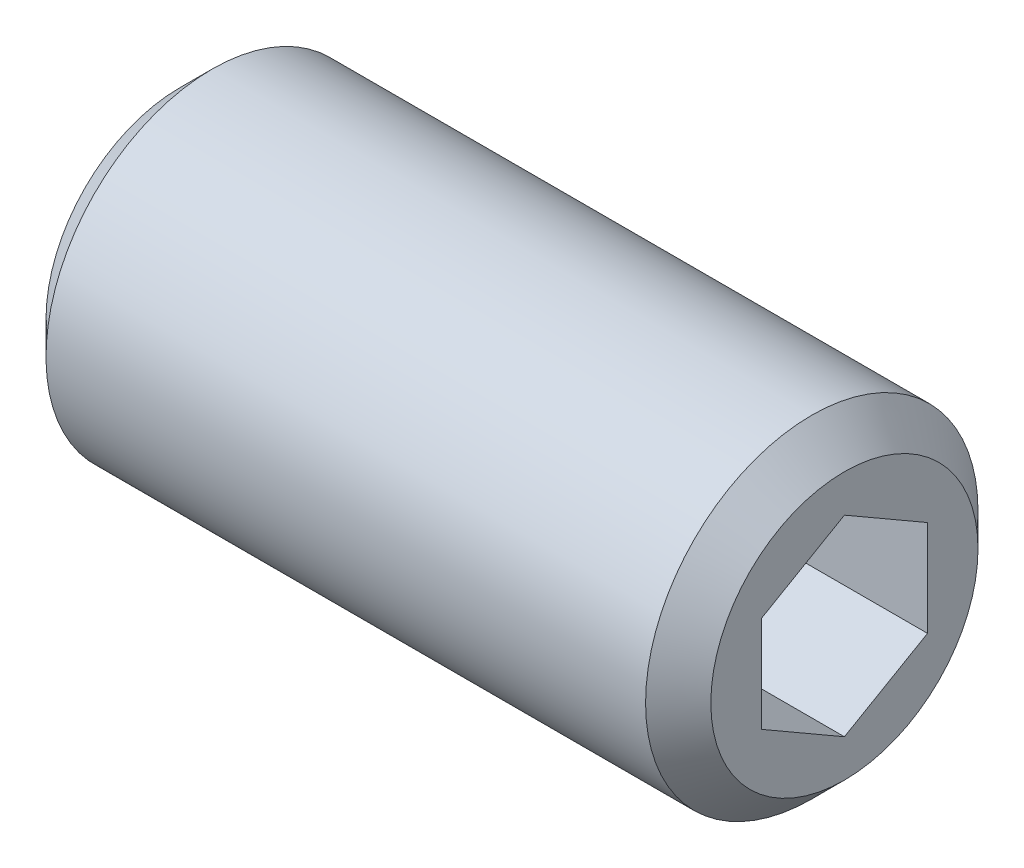
ISO-10303-21;
HEADER;
FILE_DESCRIPTION(('STEP AP214'),'2;1');
FILE_NAME('part.step','',(''),(''),'','','');
FILE_SCHEMA(('AUTOMOTIVE_DESIGN { 1 0 10303 214 1 1 1 1 }'));
ENDSEC;
DATA;
#1=APPLICATION_CONTEXT('core data for automotive mechanical design processes');
#2=APPLICATION_PROTOCOL_DEFINITION('international standard','automotive_design',2000,#1);
#3=PRODUCT_CONTEXT('',#1,'mechanical');
#4=PRODUCT('Part','Part','',(#3));
#5=PRODUCT_RELATED_PRODUCT_CATEGORY('part','',(#4));
#6=PRODUCT_DEFINITION_FORMATION('','',#4);
#7=PRODUCT_DEFINITION_CONTEXT('part definition',#1,'design');
#8=PRODUCT_DEFINITION('design','',#6,#7);
#9=PRODUCT_DEFINITION_SHAPE('','',#8);
#10=(LENGTH_UNIT() NAMED_UNIT(*) SI_UNIT(.MILLI.,.METRE.));
#11=(NAMED_UNIT(*) PLANE_ANGLE_UNIT() SI_UNIT($,.RADIAN.));
#12=(NAMED_UNIT(*) SI_UNIT($,.STERADIAN.) SOLID_ANGLE_UNIT());
#13=UNCERTAINTY_MEASURE_WITH_UNIT(LENGTH_MEASURE(1.E-05),#10,'distance_accuracy_value','');
#14=(GEOMETRIC_REPRESENTATION_CONTEXT(3) GLOBAL_UNCERTAINTY_ASSIGNED_CONTEXT((#13)) GLOBAL_UNIT_ASSIGNED_CONTEXT((#10,
#11,#12)) REPRESENTATION_CONTEXT('',''));
#15=CARTESIAN_POINT('',(0.,0.,0.));
#16=DIRECTION('',(0.,0.,1.));
#17=DIRECTION('',(1.,0.,0.));
#18=AXIS2_PLACEMENT_3D('',#15,#16,#17);
#19=CARTESIAN_POINT('',(10.,-0.72168783648703,-1.25));
#20=DIRECTION('',(0.,0.,-1.));
#21=DIRECTION('',(0.,1.,0.));
#22=AXIS2_PLACEMENT_3D('',#19,#20,#21);
#23=PLANE('',#22);
#24=DIRECTION('',(1.,0.,0.));
#25=VECTOR('',#24,1.);
#26=CARTESIAN_POINT('',(10.,-0.721687836487033,-1.24999999999999));
#27=LINE('',#26,#25);
#28=CARTESIAN_POINT('',(7.00000000002808,-0.721687836485006,-1.24999999999649));
#29=VERTEX_POINT('',#28);
#30=CARTESIAN_POINT('',(10.,-0.721687836487032,-1.24999999999999));
#31=VERTEX_POINT('',#30);
#32=EDGE_CURVE('E76',#29,#31,#27,.T.);
#33=ORIENTED_EDGE('',*,*,#32,.T.);
#34=DIRECTION('',(0.,1.,0.));
#35=VECTOR('',#34,1.);
#36=CARTESIAN_POINT('',(10.,-0.72168783648703,-1.25));
#37=LINE('',#36,#35);
#38=CARTESIAN_POINT('',(10.,0.721687836487032,-1.25));
#39=VERTEX_POINT('',#38);
#40=EDGE_CURVE('E82',#39,#31,#37,.F.);
#41=ORIENTED_EDGE('',*,*,#40,.F.);
#42=DIRECTION('',(1.,0.,0.));
#43=VECTOR('',#42,1.);
#44=CARTESIAN_POINT('',(10.,0.721687836487032,-1.25));
#45=LINE('',#44,#43);
#46=CARTESIAN_POINT('',(7.00000000002925,0.721687836482978,-1.25));
#47=VERTEX_POINT('',#46);
#48=EDGE_CURVE('E79',#39,#47,#45,.F.);
#49=ORIENTED_EDGE('',*,*,#48,.T.);
#50=CARTESIAN_POINT('',(7.00000000002808,-0.721687836478928,-1.25));
#51=CARTESIAN_POINT('',(6.98168471573105,-0.658260217049891,-1.25));
#52=CARTESIAN_POINT('',(6.96502792321347,-0.594285091312205,-1.25));
#53=CARTESIAN_POINT('',(6.93595399214924,-0.465227153328698,-1.25));
#54=CARTESIAN_POINT('',(6.92354713773467,-0.400142048719537,-1.25));
#55=CARTESIAN_POINT('',(6.90423497436378,-0.270778406576279,-1.25));
#56=CARTESIAN_POINT('',(6.89720111727032,-0.206519767721002,-1.25));
#57=CARTESIAN_POINT('',(6.88880573010383,-0.0777002896299343,-1.25));
#58=CARTESIAN_POINT('',(6.88743724625644,-0.0131399182966467,-1.25));
#59=CARTESIAN_POINT('',(6.89029143137017,0.107484209667875,-1.25));
#60=CARTESIAN_POINT('',(6.89381330328398,0.163566066932219,-1.25));
#61=CARTESIAN_POINT('',(6.90497331297347,0.275364426454331,-1.25));
#62=CARTESIAN_POINT('',(6.91261525925544,0.331080542320041,-1.25));
#63=CARTESIAN_POINT('',(6.93171864586232,0.443109217006173,-1.25));
#64=CARTESIAN_POINT('',(6.94326102641275,0.49940760423863,-1.25));
#65=CARTESIAN_POINT('',(6.96945735055178,0.611164931116565,-1.25));
#66=CARTESIAN_POINT('',(6.98410514299776,0.666625301398122,-1.25));
#67=CARTESIAN_POINT('',(7.00000000002808,0.721687836478924,-1.25));
#68=B_SPLINE_CURVE_WITH_KNOTS('',3,(#50,#51,#52,#53,#54,#55,#56,#57,#58,#59,#60,#61,#62,#63,#64,
#65,#66,#67),.UNSPECIFIED.,.F.,.F.,(4,2,2,2,2,2,2,2,4),(0.,0.198135007224751,0.396746135645448,
0.590442253850193,0.783900555566829,0.9523173641456,1.12089012111715,1.2932010140463,
1.46517373343295),.UNSPECIFIED.);
#69=EDGE_CURVE('E20',#29,#47,#68,.T.);
#70=ORIENTED_EDGE('',*,*,#69,.F.);
#71=EDGE_LOOP('',(#33,#41,#49,#70));
#72=FACE_BOUND('',#71,.T.);
#73=ADVANCED_FACE('F16',(#72),#23,.F.);
#74=CARTESIAN_POINT('',(10.,-1.44337567297406,0.));
#75=DIRECTION('',(0.,-0.866025403784438,-0.5));
#76=DIRECTION('',(0.,0.5,-0.866025403784438));
#77=AXIS2_PLACEMENT_3D('',#74,#75,#76);
#78=PLANE('',#77);
#79=DIRECTION('',(1.,0.,0.));
#80=VECTOR('',#79,1.);
#81=CARTESIAN_POINT('',(10.,-1.44337567297406,0.));
#82=LINE('',#81,#80);
#83=CARTESIAN_POINT('',(7.00000000002857,-1.44337567297086,-5.5376022724303E-12));
#84=VERTEX_POINT('',#83);
#85=CARTESIAN_POINT('',(10.,-1.44337567297406,0.));
#86=VERTEX_POINT('',#85);
#87=EDGE_CURVE('E153',#84,#86,#82,.T.);
#88=ORIENTED_EDGE('',*,*,#87,.T.);
#89=DIRECTION('',(0.,0.5,-0.866025403784438));
#90=VECTOR('',#89,1.);
#91=CARTESIAN_POINT('',(10.,-1.44337567297406,0.));
#92=LINE('',#91,#90);
#93=EDGE_CURVE('E92',#31,#86,#92,.F.);
#94=ORIENTED_EDGE('',*,*,#93,.F.);
#95=ORIENTED_EDGE('',*,*,#32,.F.);
#96=CARTESIAN_POINT('',(7.00000000002532,-1.44337567296988,-1.18869535904601E-11));
#97=CARTESIAN_POINT('',(6.98168471572935,-1.41166186325406,-0.0549299297382827));
#98=CARTESIAN_POINT('',(6.96502792321229,-1.37967430038475,-0.110334013837018));
#99=CARTESIAN_POINT('',(6.93595399214861,-1.31514533139278,-0.222101466690247));
#100=CARTESIAN_POINT('',(6.92354713773408,-1.28260277908846,-0.278466820689628));
#101=CARTESIAN_POINT('',(6.90423497436335,-1.21792095801713,-0.390499021111473));
#102=CARTESIAN_POINT('',(6.89720111727003,-1.18579163858955,-0.44614863477258));
#103=CARTESIAN_POINT('',(6.88880573010375,-1.12138189954417,-0.557709575301357));
#104=CARTESIAN_POINT('',(6.88743724625643,-1.08910171387764,-0.613620496953574));
#105=CARTESIAN_POINT('',(6.89029143137027,-1.02878964989557,-0.71808405607987));
#106=CARTESIAN_POINT('',(6.89381330328413,-1.00074872126349,-0.766652369162048));
#107=CARTESIAN_POINT('',(6.90497331297366,-0.944849541502609,-0.863472588609313));
#108=CARTESIAN_POINT('',(6.91261525925565,-0.916991483569844,-0.911724160349062));
#109=CARTESIAN_POINT('',(6.93171864586252,-0.860977146226966,-1.00874383857923));
#110=CARTESIAN_POINT('',(6.94326102641292,-0.832827952610837,-1.05749967211446));
#111=CARTESIAN_POINT('',(6.96945735055188,-0.776949289172067,-1.15428435624945));
#112=CARTESIAN_POINT('',(6.98410514299781,-0.749219104031388,-1.2023144458164));
#113=CARTESIAN_POINT('',(7.00000000002807,-0.721687836491084,-1.24999999999298));
#114=B_SPLINE_CURVE_WITH_KNOTS('',3,(#96,#97,#98,#99,#100,#101,#102,#103,#104,#105,#106,#107,
#108,#109,#110,#111,#112,#113),.UNSPECIFIED.,.F.,.F.,(4,2,2,2,2,2,2,2,4),(0.,0.198135007224029,
0.39674613564404,0.590442253848206,0.783900555564248,0.952317364142489,1.12089012111352,
1.29320101404208,1.46517373342811),.UNSPECIFIED.);
#115=EDGE_CURVE('E84',#84,#29,#114,.T.);
#116=ORIENTED_EDGE('',*,*,#115,.F.);
#117=EDGE_LOOP('',(#88,#94,#95,#116));
#118=FACE_BOUND('',#117,.T.);
#119=ADVANCED_FACE('F93',(#118),#78,.F.);
#120=CARTESIAN_POINT('',(10.,0.721687836487032,-1.25));
#121=DIRECTION('',(0.,0.866025403784439,-0.5));
#122=DIRECTION('',(0.,0.5,0.866025403784439));
#123=AXIS2_PLACEMENT_3D('',#120,#121,#122);
#124=PLANE('',#123);
#125=ORIENTED_EDGE('',*,*,#48,.F.);
#126=DIRECTION('',(0.,0.5,0.866025403784439));
#127=VECTOR('',#126,1.);
#128=CARTESIAN_POINT('',(10.,0.721687836487032,-1.25));
#129=LINE('',#128,#127);
#130=CARTESIAN_POINT('',(10.,1.44337567297406,0.));
#131=VERTEX_POINT('',#130);
#132=EDGE_CURVE('E91',#131,#39,#129,.F.);
#133=ORIENTED_EDGE('',*,*,#132,.F.);
#134=DIRECTION('',(1.,0.,0.));
#135=VECTOR('',#134,1.);
#136=CARTESIAN_POINT('',(10.,1.44337567297406,0.));
#137=LINE('',#136,#135);
#138=CARTESIAN_POINT('',(7.00000000483684,1.44337568129904,1.44192818407138E-08));
#139=VERTEX_POINT('',#138);
#140=EDGE_CURVE('E213',#131,#139,#137,.F.);
#141=ORIENTED_EDGE('',*,*,#140,.T.);
#142=CARTESIAN_POINT('',(7.00000000002808,0.721687836491084,-1.24999999999298));
#143=CARTESIAN_POINT('',(6.98168471572852,0.753401646210044,-1.19507007025817));
#144=CARTESIAN_POINT('',(6.96502792320883,0.785389209083385,-1.13966598615124));
#145=CARTESIAN_POINT('',(6.93595399214145,0.849918178084837,-1.02789853328069));
#146=CARTESIAN_POINT('',(6.92354713772593,0.882460730394627,-0.971533179272164));
#147=CARTESIAN_POINT('',(6.904234974358,0.947142551467041,-0.859500978848665));
#148=CARTESIAN_POINT('',(6.89720111726692,0.979271870890134,-0.803851365195258));
#149=CARTESIAN_POINT('',(6.88880573010328,1.04368160992575,-0.692290424683315));
#150=CARTESIAN_POINT('',(6.88743724625629,1.07596179558702,-0.636379503040235));
#151=CARTESIAN_POINT('',(6.89029143142513,1.13627386071902,-0.531915941922208));
#152=CARTESIAN_POINT('',(6.89381330357481,1.16431479050383,-0.483347626843453));
#153=CARTESIAN_POINT('',(6.90497331406052,1.220213972551,-0.386527403436211));
#154=CARTESIAN_POINT('',(6.91261526090362,1.24807203161729,-0.338275829733141));
#155=CARTESIAN_POINT('',(6.93171864890964,1.30408637125346,-0.24125614753087));
#156=CARTESIAN_POINT('',(6.94326103030822,1.33223556602824,-0.192500311988808));
#157=CARTESIAN_POINT('',(6.969457356328,1.38811423174214,-0.0957156239131654));
#158=CARTESIAN_POINT('',(6.98410514980547,1.41584441799947,-0.047685532412133));
#159=CARTESIAN_POINT('',(7.00000000792089,1.44337568664076,2.36714078989577E-08));
#160=B_SPLINE_CURVE_WITH_KNOTS('',3,(#142,#143,#144,#145,#146,#147,#148,#149,#150,#151,#152,
#153,#154,#155,#156,#157,#158,#159),.UNSPECIFIED.,.F.,.F.,(4,2,2,2,2,2,2,2,4),(0.,
0.198135007252415,0.396746135704327,0.590442253880929,0.783900555566843,0.952317371071225,
1.12089013499401,1.29320103523537,1.46517376187855),.UNSPECIFIED.);
#161=EDGE_CURVE('E148',#47,#139,#160,.T.);
#162=ORIENTED_EDGE('',*,*,#161,.F.);
#163=EDGE_LOOP('',(#125,#133,#141,#162));
#164=FACE_BOUND('',#163,.T.);
#165=ADVANCED_FACE('F154',(#164),#124,.F.);
#166=CARTESIAN_POINT('',(10.,-0.721687836487033,1.24999999999999));
#167=DIRECTION('',(0.,-0.866025403784439,0.5));
#168=DIRECTION('',(0.,-0.5,-0.866025403784439));
#169=AXIS2_PLACEMENT_3D('',#166,#167,#168);
#170=PLANE('',#169);
#171=DIRECTION('',(1.,0.,0.));
#172=VECTOR('',#171,1.);
#173=CARTESIAN_POINT('',(10.,-0.721687836487032,1.25));
#174=LINE('',#173,#172);
#175=CARTESIAN_POINT('',(6.99999999233026,-0.721687874792126,1.24999996248422));
#176=VERTEX_POINT('',#175);
#177=CARTESIAN_POINT('',(10.,-0.72168783648703,1.25));
#178=VERTEX_POINT('',#177);
#179=EDGE_CURVE('E206',#176,#178,#174,.T.);
#180=ORIENTED_EDGE('',*,*,#179,.T.);
#181=DIRECTION('',(0.,-0.5,-0.866025403784439));
#182=VECTOR('',#181,1.);
#183=CARTESIAN_POINT('',(10.,-0.721687836487033,1.24999999999999));
#184=LINE('',#183,#182);
#185=EDGE_CURVE('E219',#86,#178,#184,.F.);
#186=ORIENTED_EDGE('',*,*,#185,.F.);
#187=ORIENTED_EDGE('',*,*,#87,.F.);
#188=CARTESIAN_POINT('',(7.00000000002532,-1.44337567296988,1.18888723915321E-11));
#189=CARTESIAN_POINT('',(6.98168471573737,-1.41166186326813,0.0549299297139053));
#190=CARTESIAN_POINT('',(6.96502792322699,-1.37967430041307,0.110334013787959));
#191=CARTESIAN_POINT('',(6.93595399217328,-1.31514533145183,0.222101466587962));
#192=CARTESIAN_POINT('',(6.92354713776179,-1.28260277916402,0.278466820558751));
#193=CARTESIAN_POINT('',(6.90423497438164,-1.21792095809518,0.390499020976289));
#194=CARTESIAN_POINT('',(6.8972011172808,-1.18579163865319,0.446148634662344));
#195=CARTESIAN_POINT('',(6.88880573010548,-1.1213818995764,0.557709575245537));
#196=CARTESIAN_POINT('',(6.88743724625689,-1.08910171389284,0.613620496927234));
#197=CARTESIAN_POINT('',(6.89029143119613,-1.02878965355373,0.718084049743748));
#198=CARTESIAN_POINT('',(6.89381330236264,-1.00074872857377,0.76665235650026));
#199=CARTESIAN_POINT('',(6.90497330952934,-0.944849556056459,0.863472563401304));
#200=CARTESIAN_POINT('',(6.91261525403338,-0.916991501714989,0.911724128920747));
#201=CARTESIAN_POINT('',(6.93171863620706,-0.860977171637831,1.00874379456632));
#202=CARTESIAN_POINT('',(6.94326101407011,-0.832827981692559,1.05749962174344));
#203=CARTESIAN_POINT('',(6.9694573322499,-0.776949325461942,1.15428429339354));
#204=CARTESIAN_POINT('',(6.98410512142758,-0.74921914385904,1.20231437683288));
#205=CARTESIAN_POINT('',(6.99999997501967,-0.721687879806905,1.24999992496777));
#206=B_SPLINE_CURVE_WITH_KNOTS('',3,(#188,#189,#190,#191,#192,#193,#194,#195,#196,#197,#198,
#199,#200,#201,#202,#203,#204,#205),.UNSPECIFIED.,.F.,.F.,(4,2,2,2,2,2,2,2,4),(0.,
0.198135007136377,0.39674613545748,0.590442253750818,0.783900555564202,0.952317342198616,
1.12089007714464,1.29320094690443,1.46517364329812),.UNSPECIFIED.);
#207=EDGE_CURVE('E87',#84,#176,#206,.T.);
#208=ORIENTED_EDGE('',*,*,#207,.T.);
#209=EDGE_LOOP('',(#180,#186,#187,#208));
#210=FACE_BOUND('',#209,.T.);
#211=ADVANCED_FACE('F157',(#210),#170,.F.);
#212=CARTESIAN_POINT('',(10.,1.44337567297406,0.));
#213=DIRECTION('',(0.,0.866025403784437,0.500000000000002));
#214=DIRECTION('',(0.,-0.500000000000002,0.866025403784437));
#215=AXIS2_PLACEMENT_3D('',#212,#213,#214);
#216=PLANE('',#215);
#217=ORIENTED_EDGE('',*,*,#140,.F.);
#218=DIRECTION('',(0.,-0.500000000000002,0.866025403784437));
#219=VECTOR('',#218,1.);
#220=CARTESIAN_POINT('',(10.,1.44337567297406,0.));
#221=LINE('',#220,#219);
#222=CARTESIAN_POINT('',(10.,0.721687836487026,1.25));
#223=VERTEX_POINT('',#222);
#224=EDGE_CURVE('E39',#223,#131,#221,.F.);
#225=ORIENTED_EDGE('',*,*,#224,.F.);
#226=DIRECTION('',(1.,0.,0.));
#227=VECTOR('',#226,1.);
#228=CARTESIAN_POINT('',(10.,0.721687836487027,1.25));
#229=LINE('',#228,#227);
#230=CARTESIAN_POINT('',(6.99999998752828,0.721687858141354,1.2499999624936));
#231=VERTEX_POINT('',#230);
#232=EDGE_CURVE('E120',#223,#231,#229,.F.);
#233=ORIENTED_EDGE('',*,*,#232,.T.);
#234=CARTESIAN_POINT('',(6.99999997503322,0.721687879786573,1.24999992497959));
#235=CARTESIAN_POINT('',(6.98168469278499,0.753401688776538,1.19506999652242));
#236=CARTESIAN_POINT('',(6.96502790244663,0.785389250912655,1.13966591369855));
#237=CARTESIAN_POINT('',(6.93595397590795,0.84991821836355,1.02789846351816));
#238=CARTESIAN_POINT('',(6.92354712383688,0.882460769859521,0.971533110917548));
#239=CARTESIAN_POINT('',(6.90423496509836,0.947142589346679,0.859500913238611));
#240=CARTESIAN_POINT('',(6.89720111030793,0.979271908001656,0.803851300916048));
#241=CARTESIAN_POINT('',(6.88880572759294,1.04368164541213,0.69229036321925));
#242=CARTESIAN_POINT('',(6.88743724589592,1.07596183021656,0.636379443060154));
#243=CARTESIAN_POINT('',(6.89029143440772,1.1362738868782,0.53191589661314));
#244=CARTESIAN_POINT('',(6.89381330673708,1.16431480907455,0.483347594677999));
#245=CARTESIAN_POINT('',(6.90497331529824,1.2202139760156,0.386527397435352));
#246=CARTESIAN_POINT('',(6.91261526003188,1.24807202756447,0.338275836752829));
#247=CARTESIAN_POINT('',(6.93171864180604,1.30408635195715,0.241256180953056));
#248=CARTESIAN_POINT('',(6.94326101900994,1.33223553901265,0.19250035878118));
#249=CARTESIAN_POINT('',(6.96945733518448,1.38811418955274,0.0957156969873528));
#250=CARTESIAN_POINT('',(6.98410512301881,1.41584436835459,0.047685618399573));
#251=CARTESIAN_POINT('',(6.99999997501715,1.44337562964982,7.50397917747961E-08));
#252=B_SPLINE_CURVE_WITH_KNOTS('',3,(#234,#235,#236,#237,#238,#239,#240,#241,#242,#243,#244,
#245,#246,#247,#248,#249,#250,#251),.UNSPECIFIED.,.F.,.F.,(4,2,2,2,2,2,2,2,4),(0.,
0.198135001296799,0.39674612362692,0.590442236469801,0.783900532889381,0.952317303130372,
1.12089002161961,1.29320087403086,1.46517355318694),.UNSPECIFIED.);
#253=EDGE_CURVE('E144',#231,#139,#252,.T.);
#254=ORIENTED_EDGE('',*,*,#253,.T.);
#255=EDGE_LOOP('',(#217,#225,#233,#254));
#256=FACE_BOUND('',#255,.T.);
#257=ADVANCED_FACE('F132',(#256),#216,.F.);
#258=CARTESIAN_POINT('',(7.00499999999238,0.,0.));
#259=DIRECTION('',(1.,0.,0.));
#260=DIRECTION('',(0.,0.,-1.));
#261=AXIS2_PLACEMENT_3D('',#258,#259,#260);
#262=CONICAL_SURFACE('',#261,1.45203592694543,1.04719755116673);
#263=CARTESIAN_POINT('',(6.16666666667243,-5.6843418860808E-11,0.));
#264=VERTEX_POINT('',#263);
#265=VERTEX_LOOP('',#264);
#266=FACE_BOUND('',#265,.T.);
#267=ORIENTED_EDGE('',*,*,#207,.F.);
#268=ORIENTED_EDGE('',*,*,#115,.T.);
#269=ORIENTED_EDGE('',*,*,#69,.T.);
#270=ORIENTED_EDGE('',*,*,#161,.T.);
#271=ORIENTED_EDGE('',*,*,#253,.F.);
#272=CARTESIAN_POINT('',(7.00000003229945,0.721687863213237,1.24999996249607));
#273=CARTESIAN_POINT('',(6.98168473197304,0.658260244902207,1.24999998653027));
#274=CARTESIAN_POINT('',(6.96502793212677,0.594285118009233,1.24999999638988));
#275=CARTESIAN_POINT('',(6.93595399432419,0.465227175874861,1.25000000361879));
#276=CARTESIAN_POINT('',(6.92354714050401,0.400142068268495,1.25000000095801));
#277=CARTESIAN_POINT('',(6.90423497667475,0.270778421077491,1.2499999990657));
#278=CARTESIAN_POINT('',(6.89720111853634,0.206519780166194,1.24999999975094));
#279=CARTESIAN_POINT('',(6.8888057301747,0.0777002976807076,1.25000000024875));
#280=CARTESIAN_POINT('',(6.88743724618436,0.0131399240086906,1.25000000006238));
#281=CARTESIAN_POINT('',(6.89029143129374,-0.107484208767712,1.24999999994569));
#282=CARTESIAN_POINT('',(6.89381330335069,-0.163566068509162,1.24999999998536));
#283=CARTESIAN_POINT('',(6.9049733137077,-0.275364432899725,1.25000000001465));
#284=CARTESIAN_POINT('',(6.91261526051062,-0.331080551157129,1.25000000000422));
#285=CARTESIAN_POINT('',(6.9317186484955,-0.443109230936338,1.24999999999568));
#286=CARTESIAN_POINT('',(6.94326102993059,-0.499407620864872,1.24999999999784));
#287=CARTESIAN_POINT('',(6.96945735608878,-0.611164953121968,1.25000000000215));
#288=CARTESIAN_POINT('',(6.98410514967259,-0.666625326085875,1.2500000000043));
#289=CARTESIAN_POINT('',(7.00000000791836,-0.72168786381168,1.25));
#290=B_SPLINE_CURVE_WITH_KNOTS('',3,(#272,#273,#274,#275,#276,#277,#278,#279,#280,#281,#282,
#283,#284,#285,#286,#287,#288,#289),.UNSPECIFIED.,.F.,.F.,(4,2,2,2,2,2,2,2,4),(0.,
0.198135016058029,0.396746152643346,0.590442277485312,0.783900586116718,0.952317402140538,
1.12089016640885,1.29320106778549,1.46517379581197),.UNSPECIFIED.);
#291=EDGE_CURVE('E114',#231,#176,#290,.T.);
#292=ORIENTED_EDGE('',*,*,#291,.T.);
#293=EDGE_LOOP('',(#267,#268,#269,#270,#271,#292));
#294=FACE_BOUND('',#293,.T.);
#295=ADVANCED_FACE('F85',(#266,#294),#262,.F.);
#296=CARTESIAN_POINT('',(10.,0.721687836487027,1.25));
#297=DIRECTION('',(0.,0.,1.));
#298=DIRECTION('',(0.,-1.,0.));
#299=AXIS2_PLACEMENT_3D('',#296,#297,#298);
#300=PLANE('',#299);
#301=ORIENTED_EDGE('',*,*,#232,.F.);
#302=DIRECTION('',(0.,-1.,0.));
#303=VECTOR('',#302,1.);
#304=CARTESIAN_POINT('',(10.,0.,1.25));
#305=LINE('',#304,#303);
#306=EDGE_CURVE('E113',#223,#178,#305,.T.);
#307=ORIENTED_EDGE('',*,*,#306,.T.);
#308=ORIENTED_EDGE('',*,*,#179,.F.);
#309=ORIENTED_EDGE('',*,*,#291,.F.);
#310=EDGE_LOOP('',(#301,#307,#308,#309));
#311=FACE_BOUND('',#310,.T.);
#312=ADVANCED_FACE('F126',(#311),#300,.F.);
#313=CARTESIAN_POINT('',(10.,0.,0.));
#314=DIRECTION('',(-1.,0.,0.));
#315=DIRECTION('',(0.,-1.,0.));
#316=AXIS2_PLACEMENT_3D('',#313,#314,#315);
#317=PLANE('',#316);
#318=ORIENTED_EDGE('',*,*,#224,.T.);
#319=ORIENTED_EDGE('',*,*,#132,.T.);
#320=ORIENTED_EDGE('',*,*,#40,.T.);
#321=ORIENTED_EDGE('',*,*,#93,.T.);
#322=ORIENTED_EDGE('',*,*,#185,.T.);
#323=ORIENTED_EDGE('',*,*,#306,.F.);
#324=EDGE_LOOP('',(#318,#319,#320,#321,#322,#323));
#325=FACE_BOUND('',#324,.T.);
#326=CARTESIAN_POINT('',(9.99999999999091,0.,0.));
#327=DIRECTION('',(-1.,0.,0.));
#328=DIRECTION('',(0.,0.,1.));
#329=AXIS2_PLACEMENT_3D('',#326,#327,#328);
#330=CIRCLE('',#329,2.00924000000669);
#331=CARTESIAN_POINT('',(9.99999999999091,0.,2.00924000000669));
#332=VERTEX_POINT('',#331);
#333=EDGE_CURVE('E110',#332,#332,#330,.T.);
#334=ORIENTED_EDGE('',*,*,#333,.F.);
#335=EDGE_LOOP('',(#334));
#336=FACE_BOUND('',#335,.T.);
#337=ADVANCED_FACE('F184',(#325,#336),#317,.F.);
#338=CARTESIAN_POINT('',(0.,1.25,0.));
#339=DIRECTION('',(-1.,0.,0.));
#340=DIRECTION('',(0.,-1.,0.));
#341=AXIS2_PLACEMENT_3D('',#338,#339,#340);
#342=PLANE('',#341);
#343=CARTESIAN_POINT('',(5.68433104405908E-11,0.,0.));
#344=DIRECTION('',(1.,0.,0.));
#345=DIRECTION('',(0.,1.,0.));
#346=AXIS2_PLACEMENT_3D('',#343,#344,#345);
#347=CIRCLE('',#346,2.00924000000668);
#348=CARTESIAN_POINT('',(5.68432233036958E-11,2.00924000000668,0.));
#349=VERTEX_POINT('',#348);
#350=EDGE_CURVE('E107',#349,#349,#347,.T.);
#351=ORIENTED_EDGE('',*,*,#350,.F.);
#352=EDGE_LOOP('',(#351));
#353=FACE_BOUND('',#352,.T.);
#354=ADVANCED_FACE('F181',(#353),#342,.T.);
#355=CARTESIAN_POINT('',(9.50923999999986,0.,0.));
#356=DIRECTION('',(-1.,0.,0.));
#357=DIRECTION('',(0.,0.,1.));
#358=AXIS2_PLACEMENT_3D('',#355,#356,#357);
#359=CONICAL_SURFACE('',#358,2.50000000005457,0.785398163455362);
#360=ORIENTED_EDGE('',*,*,#333,.T.);
#361=EDGE_LOOP('',(#360));
#362=FACE_BOUND('',#361,.T.);
#363=CARTESIAN_POINT('',(9.50924,0.,0.));
#364=DIRECTION('',(1.,0.,0.));
#365=DIRECTION('',(0.,1.,0.));
#366=AXIS2_PLACEMENT_3D('',#363,#364,#365);
#367=CIRCLE('',#366,2.5);
#368=CARTESIAN_POINT('',(9.50924,2.5,0.));
#369=VERTEX_POINT('',#368);
#370=EDGE_CURVE('E30',#369,#369,#367,.F.);
#371=ORIENTED_EDGE('',*,*,#370,.F.);
#372=EDGE_LOOP('',(#371));
#373=FACE_BOUND('',#372,.T.);
#374=ADVANCED_FACE('F174',(#362,#373),#359,.T.);
#375=CARTESIAN_POINT('',(0.490759999991042,0.,0.));
#376=DIRECTION('',(1.,0.,0.));
#377=DIRECTION('',(0.,1.,0.));
#378=AXIS2_PLACEMENT_3D('',#375,#376,#377);
#379=CONICAL_SURFACE('',#378,2.49999999994088,0.785398163397448);
#380=CARTESIAN_POINT('',(0.49076,0.,0.));
#381=DIRECTION('',(1.,0.,0.));
#382=DIRECTION('',(0.,1.,0.));
#383=AXIS2_PLACEMENT_3D('',#380,#381,#382);
#384=CIRCLE('',#383,2.5);
#385=CARTESIAN_POINT('',(0.49076,2.5,0.));
#386=VERTEX_POINT('',#385);
#387=EDGE_CURVE('E10',#386,#386,#384,.T.);
#388=ORIENTED_EDGE('',*,*,#387,.F.);
#389=EDGE_LOOP('',(#388));
#390=FACE_BOUND('',#389,.T.);
#391=ORIENTED_EDGE('',*,*,#350,.T.);
#392=EDGE_LOOP('',(#391));
#393=FACE_BOUND('',#392,.T.);
#394=ADVANCED_FACE('F168',(#390,#393),#379,.T.);
#395=CARTESIAN_POINT('',(5.,0.,0.));
#396=DIRECTION('',(1.,0.,0.));
#397=DIRECTION('',(0.,1.,0.));
#398=AXIS2_PLACEMENT_3D('',#395,#396,#397);
#399=CYLINDRICAL_SURFACE('',#398,2.5);
#400=ORIENTED_EDGE('',*,*,#387,.T.);
#401=EDGE_LOOP('',(#400));
#402=FACE_BOUND('',#401,.T.);
#403=ORIENTED_EDGE('',*,*,#370,.T.);
#404=EDGE_LOOP('',(#403));
#405=FACE_BOUND('',#404,.T.);
#406=ADVANCED_FACE('F166',(#402,#405),#399,.T.);
#407=CLOSED_SHELL('',(#73,#119,#165,#211,#257,#295,#312,#337,#354,#374,#394,#406));
#408=MANIFOLD_SOLID_BREP('B1',#407);
#409=ADVANCED_BREP_SHAPE_REPRESENTATION('',(#18,#408),#14);
#410=SHAPE_DEFINITION_REPRESENTATION(#9,#409);
ENDSEC;
END-ISO-10303-21;
